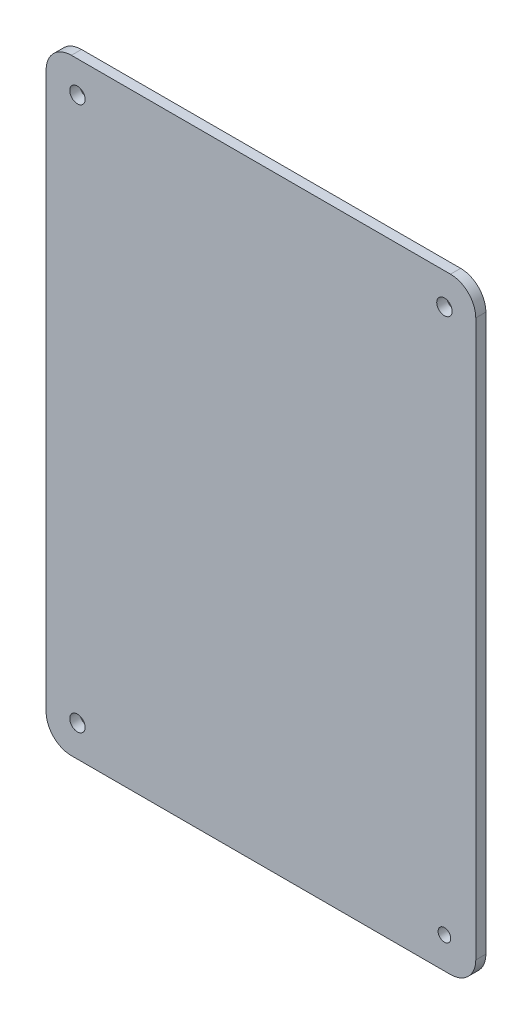
ISO-10303-21;
HEADER;
FILE_DESCRIPTION(('STEP AP214'),'2;1');
FILE_NAME('part.step','',(''),(''),'','','');
FILE_SCHEMA(('AUTOMOTIVE_DESIGN { 1 0 10303 214 1 1 1 1 }'));
ENDSEC;
DATA;
#1=APPLICATION_CONTEXT('core data for automotive mechanical design processes');
#2=APPLICATION_PROTOCOL_DEFINITION('international standard','automotive_design',2000,#1);
#3=PRODUCT_CONTEXT('',#1,'mechanical');
#4=PRODUCT('Part','Part','',(#3));
#5=PRODUCT_RELATED_PRODUCT_CATEGORY('part','',(#4));
#6=PRODUCT_DEFINITION_FORMATION('','',#4);
#7=PRODUCT_DEFINITION_CONTEXT('part definition',#1,'design');
#8=PRODUCT_DEFINITION('design','',#6,#7);
#9=PRODUCT_DEFINITION_SHAPE('','',#8);
#10=(LENGTH_UNIT() NAMED_UNIT(*) SI_UNIT(.MILLI.,.METRE.));
#11=(NAMED_UNIT(*) PLANE_ANGLE_UNIT() SI_UNIT($,.RADIAN.));
#12=(NAMED_UNIT(*) SI_UNIT($,.STERADIAN.) SOLID_ANGLE_UNIT());
#13=UNCERTAINTY_MEASURE_WITH_UNIT(LENGTH_MEASURE(1.E-05),#10,'distance_accuracy_value','');
#14=(GEOMETRIC_REPRESENTATION_CONTEXT(3) GLOBAL_UNCERTAINTY_ASSIGNED_CONTEXT((#13)) GLOBAL_UNIT_ASSIGNED_CONTEXT((#10,
#11,#12)) REPRESENTATION_CONTEXT('',''));
#15=CARTESIAN_POINT('',(0.,0.,0.));
#16=DIRECTION('',(0.,0.,1.));
#17=DIRECTION('',(1.,0.,0.));
#18=AXIS2_PLACEMENT_3D('',#15,#16,#17);
#19=CARTESIAN_POINT('',(37.5,52.2608294930875,2.));
#20=DIRECTION('',(0.,0.,1.));
#21=DIRECTION('',(1.,0.,0.));
#22=AXIS2_PLACEMENT_3D('',#19,#20,#21);
#23=PLANE('',#22);
#24=CARTESIAN_POINT('',(-36.3,51.0608294930875,2.));
#25=DIRECTION('',(0.,0.,1.));
#26=DIRECTION('',(1.,0.,0.));
#27=AXIS2_PLACEMENT_3D('',#24,#25,#26);
#28=CIRCLE('',#27,1.525);
#29=CARTESIAN_POINT('',(-34.775,51.0608294930875,2.));
#30=VERTEX_POINT('',#29);
#31=EDGE_CURVE('E294',#30,#30,#28,.T.);
#32=ORIENTED_EDGE('',*,*,#31,.F.);
#33=EDGE_LOOP('',(#32));
#34=FACE_BOUND('',#33,.T.);
#35=CARTESIAN_POINT('',(36.3,-56.5391705069125,2.));
#36=DIRECTION('',(0.,0.,1.));
#37=DIRECTION('',(1.,0.,0.));
#38=AXIS2_PLACEMENT_3D('',#35,#36,#37);
#39=CIRCLE('',#38,1.25);
#40=CARTESIAN_POINT('',(37.55,-56.5391705069125,2.));
#41=VERTEX_POINT('',#40);
#42=EDGE_CURVE('E150',#41,#41,#39,.T.);
#43=ORIENTED_EDGE('',*,*,#42,.F.);
#44=EDGE_LOOP('',(#43));
#45=FACE_BOUND('',#44,.T.);
#46=CARTESIAN_POINT('',(37.5,52.2608294930875,2.));
#47=DIRECTION('',(0.,0.,1.));
#48=DIRECTION('',(1.,0.,0.));
#49=AXIS2_PLACEMENT_3D('',#46,#47,#48);
#50=CIRCLE('',#49,4.99999999999999);
#51=CARTESIAN_POINT('',(42.5,52.2608294930875,2.));
#52=VERTEX_POINT('',#51);
#53=CARTESIAN_POINT('',(37.5,57.2608294930875,2.));
#54=VERTEX_POINT('',#53);
#55=EDGE_CURVE('E158',#52,#54,#50,.T.);
#56=ORIENTED_EDGE('',*,*,#55,.T.);
#57=DIRECTION('',(-1.,0.,0.));
#58=VECTOR('',#57,1.);
#59=CARTESIAN_POINT('',(-37.5,57.2608294930875,2.));
#60=LINE('',#59,#58);
#61=CARTESIAN_POINT('',(-37.5,57.2608294930875,2.));
#62=VERTEX_POINT('',#61);
#63=EDGE_CURVE('E102',#54,#62,#60,.T.);
#64=ORIENTED_EDGE('',*,*,#63,.T.);
#65=CARTESIAN_POINT('',(-37.5,52.2608294930875,2.));
#66=DIRECTION('',(0.,0.,1.));
#67=DIRECTION('',(1.,0.,0.));
#68=AXIS2_PLACEMENT_3D('',#65,#66,#67);
#69=CIRCLE('',#68,5.);
#70=CARTESIAN_POINT('',(-42.5,52.2608294930875,2.));
#71=VERTEX_POINT('',#70);
#72=EDGE_CURVE('E312',#62,#71,#69,.T.);
#73=ORIENTED_EDGE('',*,*,#72,.T.);
#74=DIRECTION('',(0.,-1.,0.));
#75=VECTOR('',#74,1.);
#76=CARTESIAN_POINT('',(-42.5,-57.7391705069125,2.));
#77=LINE('',#76,#75);
#78=CARTESIAN_POINT('',(-42.5,-57.7391705069125,2.));
#79=VERTEX_POINT('',#78);
#80=EDGE_CURVE('E314',#71,#79,#77,.T.);
#81=ORIENTED_EDGE('',*,*,#80,.T.);
#82=CARTESIAN_POINT('',(-37.5,-57.7391705069125,2.));
#83=DIRECTION('',(0.,0.,1.));
#84=DIRECTION('',(1.,0.,0.));
#85=AXIS2_PLACEMENT_3D('',#82,#83,#84);
#86=CIRCLE('',#85,5.);
#87=CARTESIAN_POINT('',(-37.5,-62.7391705069125,2.));
#88=VERTEX_POINT('',#87);
#89=EDGE_CURVE('E129',#79,#88,#86,.T.);
#90=ORIENTED_EDGE('',*,*,#89,.T.);
#91=DIRECTION('',(1.,0.,0.));
#92=VECTOR('',#91,1.);
#93=CARTESIAN_POINT('',(-37.5,-62.7391705069125,2.));
#94=LINE('',#93,#92);
#95=CARTESIAN_POINT('',(37.5,-62.7391705069125,2.));
#96=VERTEX_POINT('',#95);
#97=EDGE_CURVE('E119',#88,#96,#94,.T.);
#98=ORIENTED_EDGE('',*,*,#97,.T.);
#99=CARTESIAN_POINT('',(37.5,-57.7391705069125,2.));
#100=DIRECTION('',(0.,0.,1.));
#101=DIRECTION('',(1.,0.,0.));
#102=AXIS2_PLACEMENT_3D('',#99,#100,#101);
#103=CIRCLE('',#102,5.);
#104=CARTESIAN_POINT('',(42.5,-57.7391705069125,2.));
#105=VERTEX_POINT('',#104);
#106=EDGE_CURVE('E121',#96,#105,#103,.T.);
#107=ORIENTED_EDGE('',*,*,#106,.T.);
#108=DIRECTION('',(0.,1.,0.));
#109=VECTOR('',#108,1.);
#110=CARTESIAN_POINT('',(42.5,-57.7391705069125,2.));
#111=LINE('',#110,#109);
#112=EDGE_CURVE('E58',#105,#52,#111,.T.);
#113=ORIENTED_EDGE('',*,*,#112,.T.);
#114=EDGE_LOOP('',(#56,#64,#73,#81,#90,#98,#107,#113));
#115=FACE_BOUND('',#114,.T.);
#116=CARTESIAN_POINT('',(36.3,51.0608294930875,2.));
#117=DIRECTION('',(0.,0.,1.));
#118=DIRECTION('',(1.,0.,0.));
#119=AXIS2_PLACEMENT_3D('',#116,#117,#118);
#120=CIRCLE('',#119,1.525);
#121=CARTESIAN_POINT('',(37.825,51.0608294930875,2.));
#122=VERTEX_POINT('',#121);
#123=EDGE_CURVE('E301',#122,#122,#120,.T.);
#124=ORIENTED_EDGE('',*,*,#123,.F.);
#125=EDGE_LOOP('',(#124));
#126=FACE_BOUND('',#125,.T.);
#127=CARTESIAN_POINT('',(-36.3,-56.5391705069125,2.));
#128=DIRECTION('',(0.,0.,1.));
#129=DIRECTION('',(1.,0.,0.));
#130=AXIS2_PLACEMENT_3D('',#127,#128,#129);
#131=CIRCLE('',#130,1.525);
#132=CARTESIAN_POINT('',(-34.775,-56.5391705069125,2.));
#133=VERTEX_POINT('',#132);
#134=EDGE_CURVE('E288',#133,#133,#131,.T.);
#135=ORIENTED_EDGE('',*,*,#134,.F.);
#136=EDGE_LOOP('',(#135));
#137=FACE_BOUND('',#136,.T.);
#138=ADVANCED_FACE('F43',(#34,#45,#115,#126,#137),#23,.T.);
#139=CARTESIAN_POINT('',(37.5,52.2608294930875,0.));
#140=DIRECTION('',(0.,0.,1.));
#141=DIRECTION('',(1.,0.,0.));
#142=AXIS2_PLACEMENT_3D('',#139,#140,#141);
#143=PLANE('',#142);
#144=CARTESIAN_POINT('',(-19.5,-2.73917050691248,0.));
#145=DIRECTION('',(0.,0.,1.));
#146=DIRECTION('',(1.,0.,0.));
#147=AXIS2_PLACEMENT_3D('',#144,#145,#146);
#148=CIRCLE('',#147,4.);
#149=CARTESIAN_POINT('',(-15.5,-2.73917050691248,0.));
#150=VERTEX_POINT('',#149);
#151=EDGE_CURVE('E187',#150,#150,#148,.T.);
#152=ORIENTED_EDGE('',*,*,#151,.T.);
#153=EDGE_LOOP('',(#152));
#154=FACE_BOUND('',#153,.T.);
#155=CARTESIAN_POINT('',(-19.5,36.2608294930875,0.));
#156=DIRECTION('',(0.,0.,1.));
#157=DIRECTION('',(1.,0.,0.));
#158=AXIS2_PLACEMENT_3D('',#155,#156,#157);
#159=CIRCLE('',#158,4.00000000000001);
#160=CARTESIAN_POINT('',(-15.5,36.2608294930875,0.));
#161=VERTEX_POINT('',#160);
#162=EDGE_CURVE('E182',#161,#161,#159,.T.);
#163=ORIENTED_EDGE('',*,*,#162,.T.);
#164=EDGE_LOOP('',(#163));
#165=FACE_BOUND('',#164,.T.);
#166=CARTESIAN_POINT('',(19.5,-2.73917050691248,0.));
#167=DIRECTION('',(0.,0.,1.));
#168=DIRECTION('',(1.,0.,0.));
#169=AXIS2_PLACEMENT_3D('',#166,#167,#168);
#170=CIRCLE('',#169,4.);
#171=CARTESIAN_POINT('',(23.5,-2.73917050691248,0.));
#172=VERTEX_POINT('',#171);
#173=EDGE_CURVE('E179',#172,#172,#170,.T.);
#174=ORIENTED_EDGE('',*,*,#173,.T.);
#175=EDGE_LOOP('',(#174));
#176=FACE_BOUND('',#175,.T.);
#177=CARTESIAN_POINT('',(19.5,36.2608294930875,0.));
#178=DIRECTION('',(0.,0.,1.));
#179=DIRECTION('',(1.,0.,0.));
#180=AXIS2_PLACEMENT_3D('',#177,#178,#179);
#181=CIRCLE('',#180,4.);
#182=CARTESIAN_POINT('',(23.5,36.2608294930875,0.));
#183=VERTEX_POINT('',#182);
#184=EDGE_CURVE('E180',#183,#183,#181,.T.);
#185=ORIENTED_EDGE('',*,*,#184,.T.);
#186=EDGE_LOOP('',(#185));
#187=FACE_BOUND('',#186,.T.);
#188=CARTESIAN_POINT('',(37.5,52.2608294930875,0.));
#189=DIRECTION('',(0.,0.,1.));
#190=DIRECTION('',(1.,0.,0.));
#191=AXIS2_PLACEMENT_3D('',#188,#189,#190);
#192=CIRCLE('',#191,4.99999999999999);
#193=CARTESIAN_POINT('',(42.5,52.2608294930875,0.));
#194=VERTEX_POINT('',#193);
#195=CARTESIAN_POINT('',(37.5,57.2608294930875,0.));
#196=VERTEX_POINT('',#195);
#197=EDGE_CURVE('E144',#194,#196,#192,.T.);
#198=ORIENTED_EDGE('',*,*,#197,.F.);
#199=DIRECTION('',(0.,1.,0.));
#200=VECTOR('',#199,1.);
#201=CARTESIAN_POINT('',(42.5,-57.7391705069125,0.));
#202=LINE('',#201,#200);
#203=CARTESIAN_POINT('',(42.5,-57.7391705069125,0.));
#204=VERTEX_POINT('',#203);
#205=EDGE_CURVE('E98',#204,#194,#202,.T.);
#206=ORIENTED_EDGE('',*,*,#205,.F.);
#207=CARTESIAN_POINT('',(37.5,-57.7391705069125,0.));
#208=DIRECTION('',(0.,0.,1.));
#209=DIRECTION('',(1.,0.,0.));
#210=AXIS2_PLACEMENT_3D('',#207,#208,#209);
#211=CIRCLE('',#210,5.);
#212=CARTESIAN_POINT('',(37.5,-62.7391705069125,0.));
#213=VERTEX_POINT('',#212);
#214=EDGE_CURVE('E86',#213,#204,#211,.T.);
#215=ORIENTED_EDGE('',*,*,#214,.F.);
#216=DIRECTION('',(1.,0.,0.));
#217=VECTOR('',#216,1.);
#218=CARTESIAN_POINT('',(-37.5,-62.7391705069125,0.));
#219=LINE('',#218,#217);
#220=CARTESIAN_POINT('',(-37.5,-62.7391705069125,0.));
#221=VERTEX_POINT('',#220);
#222=EDGE_CURVE('E134',#221,#213,#219,.T.);
#223=ORIENTED_EDGE('',*,*,#222,.F.);
#224=CARTESIAN_POINT('',(-37.5,-57.7391705069125,0.));
#225=DIRECTION('',(0.,0.,1.));
#226=DIRECTION('',(1.,0.,0.));
#227=AXIS2_PLACEMENT_3D('',#224,#225,#226);
#228=CIRCLE('',#227,5.);
#229=CARTESIAN_POINT('',(-42.5,-57.7391705069125,0.));
#230=VERTEX_POINT('',#229);
#231=EDGE_CURVE('E154',#230,#221,#228,.T.);
#232=ORIENTED_EDGE('',*,*,#231,.F.);
#233=DIRECTION('',(0.,-1.,0.));
#234=VECTOR('',#233,1.);
#235=CARTESIAN_POINT('',(-42.5,-57.7391705069125,0.));
#236=LINE('',#235,#234);
#237=CARTESIAN_POINT('',(-42.5,52.2608294930875,0.));
#238=VERTEX_POINT('',#237);
#239=EDGE_CURVE('E155',#238,#230,#236,.T.);
#240=ORIENTED_EDGE('',*,*,#239,.F.);
#241=CARTESIAN_POINT('',(-37.5,52.2608294930875,0.));
#242=DIRECTION('',(0.,0.,1.));
#243=DIRECTION('',(1.,0.,0.));
#244=AXIS2_PLACEMENT_3D('',#241,#242,#243);
#245=CIRCLE('',#244,5.);
#246=CARTESIAN_POINT('',(-37.5,57.2608294930875,0.));
#247=VERTEX_POINT('',#246);
#248=EDGE_CURVE('E147',#247,#238,#245,.T.);
#249=ORIENTED_EDGE('',*,*,#248,.F.);
#250=DIRECTION('',(-1.,0.,0.));
#251=VECTOR('',#250,1.);
#252=CARTESIAN_POINT('',(-37.5,57.2608294930875,0.));
#253=LINE('',#252,#251);
#254=EDGE_CURVE('E146',#196,#247,#253,.T.);
#255=ORIENTED_EDGE('',*,*,#254,.F.);
#256=EDGE_LOOP('',(#198,#206,#215,#223,#232,#240,#249,#255));
#257=FACE_BOUND('',#256,.T.);
#258=CARTESIAN_POINT('',(36.3,-56.5391705069125,0.));
#259=DIRECTION('',(0.,0.,1.));
#260=DIRECTION('',(1.,0.,0.));
#261=AXIS2_PLACEMENT_3D('',#258,#259,#260);
#262=CIRCLE('',#261,1.25);
#263=CARTESIAN_POINT('',(37.55,-56.5391705069125,0.));
#264=VERTEX_POINT('',#263);
#265=EDGE_CURVE('E302',#264,#264,#262,.T.);
#266=ORIENTED_EDGE('',*,*,#265,.T.);
#267=EDGE_LOOP('',(#266));
#268=FACE_BOUND('',#267,.T.);
#269=CARTESIAN_POINT('',(36.3,51.0608294930875,0.));
#270=DIRECTION('',(0.,0.,1.));
#271=DIRECTION('',(1.,0.,0.));
#272=AXIS2_PLACEMENT_3D('',#269,#270,#271);
#273=CIRCLE('',#272,1.525);
#274=CARTESIAN_POINT('',(37.825,51.0608294930875,0.));
#275=VERTEX_POINT('',#274);
#276=EDGE_CURVE('E296',#275,#275,#273,.T.);
#277=ORIENTED_EDGE('',*,*,#276,.T.);
#278=EDGE_LOOP('',(#277));
#279=FACE_BOUND('',#278,.T.);
#280=CARTESIAN_POINT('',(-36.3,51.0608294930875,0.));
#281=DIRECTION('',(0.,0.,1.));
#282=DIRECTION('',(1.,0.,0.));
#283=AXIS2_PLACEMENT_3D('',#280,#281,#282);
#284=CIRCLE('',#283,1.525);
#285=CARTESIAN_POINT('',(-34.775,51.0608294930875,0.));
#286=VERTEX_POINT('',#285);
#287=EDGE_CURVE('E292',#286,#286,#284,.T.);
#288=ORIENTED_EDGE('',*,*,#287,.T.);
#289=EDGE_LOOP('',(#288));
#290=FACE_BOUND('',#289,.T.);
#291=CARTESIAN_POINT('',(-36.3,-56.5391705069125,0.));
#292=DIRECTION('',(0.,0.,1.));
#293=DIRECTION('',(1.,0.,0.));
#294=AXIS2_PLACEMENT_3D('',#291,#292,#293);
#295=CIRCLE('',#294,1.525);
#296=CARTESIAN_POINT('',(-34.775,-56.5391705069125,0.));
#297=VERTEX_POINT('',#296);
#298=EDGE_CURVE('E290',#297,#297,#295,.T.);
#299=ORIENTED_EDGE('',*,*,#298,.T.);
#300=EDGE_LOOP('',(#299));
#301=FACE_BOUND('',#300,.T.);
#302=ADVANCED_FACE('F214',(#154,#165,#176,#187,#257,#268,#279,#290,#301),#143,.F.);
#303=CARTESIAN_POINT('',(37.5,52.2608294930875,2.));
#304=DIRECTION('',(0.,0.,-1.));
#305=DIRECTION('',(-1.,0.,0.));
#306=AXIS2_PLACEMENT_3D('',#303,#304,#305);
#307=CYLINDRICAL_SURFACE('',#306,4.99999999999999);
#308=ORIENTED_EDGE('',*,*,#197,.T.);
#309=DIRECTION('',(0.,0.,-1.));
#310=VECTOR('',#309,1.);
#311=CARTESIAN_POINT('',(37.5,57.2608294930875,2.));
#312=LINE('',#311,#310);
#313=EDGE_CURVE('E175',#54,#196,#312,.T.);
#314=ORIENTED_EDGE('',*,*,#313,.F.);
#315=ORIENTED_EDGE('',*,*,#55,.F.);
#316=DIRECTION('',(0.,0.,-1.));
#317=VECTOR('',#316,1.);
#318=CARTESIAN_POINT('',(42.5,52.2608294930875,2.));
#319=LINE('',#318,#317);
#320=EDGE_CURVE('E137',#52,#194,#319,.T.);
#321=ORIENTED_EDGE('',*,*,#320,.T.);
#322=EDGE_LOOP('',(#308,#314,#315,#321));
#323=FACE_BOUND('',#322,.T.);
#324=ADVANCED_FACE('F218',(#323),#307,.T.);
#325=CARTESIAN_POINT('',(-37.5,57.2608294930875,2.));
#326=DIRECTION('',(0.,-1.,0.));
#327=DIRECTION('',(0.,0.,-1.));
#328=AXIS2_PLACEMENT_3D('',#325,#326,#327);
#329=PLANE('',#328);
#330=ORIENTED_EDGE('',*,*,#254,.T.);
#331=DIRECTION('',(0.,0.,-1.));
#332=VECTOR('',#331,1.);
#333=CARTESIAN_POINT('',(-37.5,57.2608294930875,2.));
#334=LINE('',#333,#332);
#335=EDGE_CURVE('E169',#62,#247,#334,.T.);
#336=ORIENTED_EDGE('',*,*,#335,.F.);
#337=ORIENTED_EDGE('',*,*,#63,.F.);
#338=ORIENTED_EDGE('',*,*,#313,.T.);
#339=EDGE_LOOP('',(#330,#336,#337,#338));
#340=FACE_BOUND('',#339,.T.);
#341=ADVANCED_FACE('F244',(#340),#329,.F.);
#342=CARTESIAN_POINT('',(-37.5,52.2608294930875,2.));
#343=DIRECTION('',(0.,0.,-1.));
#344=DIRECTION('',(-1.,0.,0.));
#345=AXIS2_PLACEMENT_3D('',#342,#343,#344);
#346=CYLINDRICAL_SURFACE('',#345,5.);
#347=ORIENTED_EDGE('',*,*,#248,.T.);
#348=DIRECTION('',(0.,0.,-1.));
#349=VECTOR('',#348,1.);
#350=CARTESIAN_POINT('',(-42.5,52.2608294930875,2.));
#351=LINE('',#350,#349);
#352=EDGE_CURVE('E168',#71,#238,#351,.T.);
#353=ORIENTED_EDGE('',*,*,#352,.F.);
#354=ORIENTED_EDGE('',*,*,#72,.F.);
#355=ORIENTED_EDGE('',*,*,#335,.T.);
#356=EDGE_LOOP('',(#347,#353,#354,#355));
#357=FACE_BOUND('',#356,.T.);
#358=ADVANCED_FACE('F241',(#357),#346,.T.);
#359=CARTESIAN_POINT('',(-42.5,-57.7391705069125,2.));
#360=DIRECTION('',(1.,0.,0.));
#361=DIRECTION('',(0.,0.,-1.));
#362=AXIS2_PLACEMENT_3D('',#359,#360,#361);
#363=PLANE('',#362);
#364=ORIENTED_EDGE('',*,*,#239,.T.);
#365=DIRECTION('',(0.,0.,-1.));
#366=VECTOR('',#365,1.);
#367=CARTESIAN_POINT('',(-42.5,-57.7391705069125,2.));
#368=LINE('',#367,#366);
#369=EDGE_CURVE('E161',#79,#230,#368,.T.);
#370=ORIENTED_EDGE('',*,*,#369,.F.);
#371=ORIENTED_EDGE('',*,*,#80,.F.);
#372=ORIENTED_EDGE('',*,*,#352,.T.);
#373=EDGE_LOOP('',(#364,#370,#371,#372));
#374=FACE_BOUND('',#373,.T.);
#375=ADVANCED_FACE('F240',(#374),#363,.F.);
#376=CARTESIAN_POINT('',(-37.5,-57.7391705069125,2.));
#377=DIRECTION('',(0.,0.,-1.));
#378=DIRECTION('',(-1.,0.,0.));
#379=AXIS2_PLACEMENT_3D('',#376,#377,#378);
#380=CYLINDRICAL_SURFACE('',#379,5.);
#381=ORIENTED_EDGE('',*,*,#231,.T.);
#382=DIRECTION('',(0.,0.,-1.));
#383=VECTOR('',#382,1.);
#384=CARTESIAN_POINT('',(-37.5,-62.7391705069125,2.));
#385=LINE('',#384,#383);
#386=EDGE_CURVE('E131',#88,#221,#385,.T.);
#387=ORIENTED_EDGE('',*,*,#386,.F.);
#388=ORIENTED_EDGE('',*,*,#89,.F.);
#389=ORIENTED_EDGE('',*,*,#369,.T.);
#390=EDGE_LOOP('',(#381,#387,#388,#389));
#391=FACE_BOUND('',#390,.T.);
#392=ADVANCED_FACE('F234',(#391),#380,.T.);
#393=CARTESIAN_POINT('',(-37.5,-62.7391705069125,2.));
#394=DIRECTION('',(0.,1.,0.));
#395=DIRECTION('',(0.,0.,1.));
#396=AXIS2_PLACEMENT_3D('',#393,#394,#395);
#397=PLANE('',#396);
#398=ORIENTED_EDGE('',*,*,#222,.T.);
#399=DIRECTION('',(0.,0.,-1.));
#400=VECTOR('',#399,1.);
#401=CARTESIAN_POINT('',(37.5,-62.7391705069125,2.));
#402=LINE('',#401,#400);
#403=EDGE_CURVE('E132',#96,#213,#402,.T.);
#404=ORIENTED_EDGE('',*,*,#403,.F.);
#405=ORIENTED_EDGE('',*,*,#97,.F.);
#406=ORIENTED_EDGE('',*,*,#386,.T.);
#407=EDGE_LOOP('',(#398,#404,#405,#406));
#408=FACE_BOUND('',#407,.T.);
#409=ADVANCED_FACE('F135',(#408),#397,.F.);
#410=CARTESIAN_POINT('',(37.5,-57.7391705069125,2.));
#411=DIRECTION('',(0.,0.,-1.));
#412=DIRECTION('',(-1.,0.,0.));
#413=AXIS2_PLACEMENT_3D('',#410,#411,#412);
#414=CYLINDRICAL_SURFACE('',#413,5.);
#415=ORIENTED_EDGE('',*,*,#214,.T.);
#416=DIRECTION('',(0.,0.,-1.));
#417=VECTOR('',#416,1.);
#418=CARTESIAN_POINT('',(42.5,-57.7391705069125,2.));
#419=LINE('',#418,#417);
#420=EDGE_CURVE('E139',#105,#204,#419,.T.);
#421=ORIENTED_EDGE('',*,*,#420,.F.);
#422=ORIENTED_EDGE('',*,*,#106,.F.);
#423=ORIENTED_EDGE('',*,*,#403,.T.);
#424=EDGE_LOOP('',(#415,#421,#422,#423));
#425=FACE_BOUND('',#424,.T.);
#426=ADVANCED_FACE('F140',(#425),#414,.T.);
#427=CARTESIAN_POINT('',(42.5,-57.7391705069125,2.));
#428=DIRECTION('',(-1.,0.,0.));
#429=DIRECTION('',(0.,0.,1.));
#430=AXIS2_PLACEMENT_3D('',#427,#428,#429);
#431=PLANE('',#430);
#432=ORIENTED_EDGE('',*,*,#205,.T.);
#433=ORIENTED_EDGE('',*,*,#320,.F.);
#434=ORIENTED_EDGE('',*,*,#112,.F.);
#435=ORIENTED_EDGE('',*,*,#420,.T.);
#436=EDGE_LOOP('',(#432,#433,#434,#435));
#437=FACE_BOUND('',#436,.T.);
#438=ADVANCED_FACE('F227',(#437),#431,.F.);
#439=CARTESIAN_POINT('',(36.3,-56.5391705069125,2.));
#440=DIRECTION('',(0.,0.,-1.));
#441=DIRECTION('',(-1.,0.,0.));
#442=AXIS2_PLACEMENT_3D('',#439,#440,#441);
#443=CYLINDRICAL_SURFACE('',#442,1.25);
#444=ORIENTED_EDGE('',*,*,#42,.T.);
#445=EDGE_LOOP('',(#444));
#446=FACE_BOUND('',#445,.T.);
#447=ORIENTED_EDGE('',*,*,#265,.F.);
#448=EDGE_LOOP('',(#447));
#449=FACE_BOUND('',#448,.T.);
#450=ADVANCED_FACE('F223',(#446,#449),#443,.F.);
#451=CARTESIAN_POINT('',(36.3,51.0608294930875,2.));
#452=DIRECTION('',(0.,0.,-1.));
#453=DIRECTION('',(-1.,0.,0.));
#454=AXIS2_PLACEMENT_3D('',#451,#452,#453);
#455=CYLINDRICAL_SURFACE('',#454,1.525);
#456=ORIENTED_EDGE('',*,*,#123,.T.);
#457=EDGE_LOOP('',(#456));
#458=FACE_BOUND('',#457,.T.);
#459=ORIENTED_EDGE('',*,*,#276,.F.);
#460=EDGE_LOOP('',(#459));
#461=FACE_BOUND('',#460,.T.);
#462=ADVANCED_FACE('F346',(#458,#461),#455,.F.);
#463=CARTESIAN_POINT('',(-36.3,51.0608294930875,2.));
#464=DIRECTION('',(0.,0.,-1.));
#465=DIRECTION('',(-1.,0.,0.));
#466=AXIS2_PLACEMENT_3D('',#463,#464,#465);
#467=CYLINDRICAL_SURFACE('',#466,1.525);
#468=ORIENTED_EDGE('',*,*,#31,.T.);
#469=EDGE_LOOP('',(#468));
#470=FACE_BOUND('',#469,.T.);
#471=ORIENTED_EDGE('',*,*,#287,.F.);
#472=EDGE_LOOP('',(#471));
#473=FACE_BOUND('',#472,.T.);
#474=ADVANCED_FACE('F339',(#470,#473),#467,.F.);
#475=CARTESIAN_POINT('',(-36.3,-56.5391705069125,2.));
#476=DIRECTION('',(0.,0.,-1.));
#477=DIRECTION('',(-1.,0.,0.));
#478=AXIS2_PLACEMENT_3D('',#475,#476,#477);
#479=CYLINDRICAL_SURFACE('',#478,1.525);
#480=ORIENTED_EDGE('',*,*,#134,.T.);
#481=EDGE_LOOP('',(#480));
#482=FACE_BOUND('',#481,.T.);
#483=ORIENTED_EDGE('',*,*,#298,.F.);
#484=EDGE_LOOP('',(#483));
#485=FACE_BOUND('',#484,.T.);
#486=ADVANCED_FACE('F337',(#482,#485),#479,.F.);
#487=CARTESIAN_POINT('',(19.5,36.2608294930875,-8.));
#488=DIRECTION('',(0.,0.,1.));
#489=DIRECTION('',(1.,0.,0.));
#490=AXIS2_PLACEMENT_3D('',#487,#488,#489);
#491=CYLINDRICAL_SURFACE('',#490,2.);
#492=CARTESIAN_POINT('',(19.5,36.2608294930875,-2.));
#493=DIRECTION('',(0.,0.,1.));
#494=DIRECTION('',(1.,0.,0.));
#495=AXIS2_PLACEMENT_3D('',#492,#493,#494);
#496=CIRCLE('',#495,2.);
#497=CARTESIAN_POINT('',(21.5,36.2608294930875,-2.));
#498=VERTEX_POINT('',#497);
#499=EDGE_CURVE('E11',#498,#498,#496,.F.);
#500=ORIENTED_EDGE('',*,*,#499,.T.);
#501=EDGE_LOOP('',(#500));
#502=FACE_BOUND('',#501,.T.);
#503=CARTESIAN_POINT('',(19.5,36.2608294930875,-8.));
#504=DIRECTION('',(0.,0.,-1.));
#505=DIRECTION('',(-1.,0.,0.));
#506=AXIS2_PLACEMENT_3D('',#503,#504,#505);
#507=CIRCLE('',#506,2.);
#508=CARTESIAN_POINT('',(17.5,36.2608294930875,-8.));
#509=VERTEX_POINT('',#508);
#510=EDGE_CURVE('E278',#509,#509,#507,.T.);
#511=ORIENTED_EDGE('',*,*,#510,.F.);
#512=EDGE_LOOP('',(#511));
#513=FACE_BOUND('',#512,.T.);
#514=ADVANCED_FACE('F336',(#502,#513),#491,.T.);
#515=CARTESIAN_POINT('',(19.5,36.2608294930875,-8.));
#516=DIRECTION('',(0.,0.,-1.));
#517=DIRECTION('',(-1.,0.,0.));
#518=AXIS2_PLACEMENT_3D('',#515,#516,#517);
#519=PLANE('',#518);
#520=CARTESIAN_POINT('',(19.5,36.2608294930875,-8.));
#521=DIRECTION('',(0.,0.,-1.));
#522=DIRECTION('',(-1.,0.,0.));
#523=AXIS2_PLACEMENT_3D('',#520,#521,#522);
#524=CIRCLE('',#523,1.525);
#525=CARTESIAN_POINT('',(17.975,36.2608294930875,-8.));
#526=VERTEX_POINT('',#525);
#527=EDGE_CURVE('E655',#526,#526,#524,.T.);
#528=ORIENTED_EDGE('',*,*,#527,.F.);
#529=EDGE_LOOP('',(#528));
#530=FACE_BOUND('',#529,.T.);
#531=ORIENTED_EDGE('',*,*,#510,.T.);
#532=EDGE_LOOP('',(#531));
#533=FACE_BOUND('',#532,.T.);
#534=ADVANCED_FACE('F350',(#530,#533),#519,.T.);
#535=CARTESIAN_POINT('',(-19.5,36.2608294930875,-8.));
#536=DIRECTION('',(0.,0.,1.));
#537=DIRECTION('',(1.,0.,0.));
#538=AXIS2_PLACEMENT_3D('',#535,#536,#537);
#539=CYLINDRICAL_SURFACE('',#538,2.00000000000001);
#540=CARTESIAN_POINT('',(-19.5,36.2608294930875,-2.));
#541=DIRECTION('',(0.,0.,1.));
#542=DIRECTION('',(1.,0.,0.));
#543=AXIS2_PLACEMENT_3D('',#540,#541,#542);
#544=CIRCLE('',#543,2.00000000000001);
#545=CARTESIAN_POINT('',(-17.5,36.2608294930875,-2.));
#546=VERTEX_POINT('',#545);
#547=EDGE_CURVE('E186',#546,#546,#544,.F.);
#548=ORIENTED_EDGE('',*,*,#547,.T.);
#549=EDGE_LOOP('',(#548));
#550=FACE_BOUND('',#549,.T.);
#551=CARTESIAN_POINT('',(-19.5,36.2608294930875,-8.));
#552=DIRECTION('',(0.,0.,-1.));
#553=DIRECTION('',(-1.,0.,0.));
#554=AXIS2_PLACEMENT_3D('',#551,#552,#553);
#555=CIRCLE('',#554,2.00000000000001);
#556=CARTESIAN_POINT('',(-21.5,36.2608294930875,-8.));
#557=VERTEX_POINT('',#556);
#558=EDGE_CURVE('E273',#557,#557,#555,.T.);
#559=ORIENTED_EDGE('',*,*,#558,.F.);
#560=EDGE_LOOP('',(#559));
#561=FACE_BOUND('',#560,.T.);
#562=ADVANCED_FACE('F433',(#550,#561),#539,.T.);
#563=CARTESIAN_POINT('',(-19.5,36.2608294930875,-8.));
#564=DIRECTION('',(0.,0.,-1.));
#565=DIRECTION('',(-1.,0.,0.));
#566=AXIS2_PLACEMENT_3D('',#563,#564,#565);
#567=PLANE('',#566);
#568=CARTESIAN_POINT('',(-19.5,36.2608294930875,-8.));
#569=DIRECTION('',(0.,0.,-1.));
#570=DIRECTION('',(-1.,0.,0.));
#571=AXIS2_PLACEMENT_3D('',#568,#569,#570);
#572=CIRCLE('',#571,1.525);
#573=CARTESIAN_POINT('',(-21.025,36.2608294930875,-8.));
#574=VERTEX_POINT('',#573);
#575=EDGE_CURVE('E668',#574,#574,#572,.T.);
#576=ORIENTED_EDGE('',*,*,#575,.F.);
#577=EDGE_LOOP('',(#576));
#578=FACE_BOUND('',#577,.T.);
#579=ORIENTED_EDGE('',*,*,#558,.T.);
#580=EDGE_LOOP('',(#579));
#581=FACE_BOUND('',#580,.T.);
#582=ADVANCED_FACE('F268',(#578,#581),#567,.T.);
#583=CARTESIAN_POINT('',(-19.5,-2.73917050691248,-8.));
#584=DIRECTION('',(0.,0.,1.));
#585=DIRECTION('',(1.,0.,0.));
#586=AXIS2_PLACEMENT_3D('',#583,#584,#585);
#587=CYLINDRICAL_SURFACE('',#586,2.);
#588=CARTESIAN_POINT('',(-19.5,-2.73917050691248,-2.));
#589=DIRECTION('',(0.,0.,1.));
#590=DIRECTION('',(1.,0.,0.));
#591=AXIS2_PLACEMENT_3D('',#588,#589,#590);
#592=CIRCLE('',#591,2.);
#593=CARTESIAN_POINT('',(-17.5,-2.73917050691248,-2.));
#594=VERTEX_POINT('',#593);
#595=EDGE_CURVE('E172',#594,#594,#592,.F.);
#596=ORIENTED_EDGE('',*,*,#595,.T.);
#597=EDGE_LOOP('',(#596));
#598=FACE_BOUND('',#597,.T.);
#599=CARTESIAN_POINT('',(-19.5,-2.73917050691248,-8.));
#600=DIRECTION('',(0.,0.,-1.));
#601=DIRECTION('',(-1.,0.,0.));
#602=AXIS2_PLACEMENT_3D('',#599,#600,#601);
#603=CIRCLE('',#602,2.);
#604=CARTESIAN_POINT('',(-21.5,-2.73917050691248,-8.));
#605=VERTEX_POINT('',#604);
#606=EDGE_CURVE('E271',#605,#605,#603,.T.);
#607=ORIENTED_EDGE('',*,*,#606,.F.);
#608=EDGE_LOOP('',(#607));
#609=FACE_BOUND('',#608,.T.);
#610=ADVANCED_FACE('F261',(#598,#609),#587,.T.);
#611=CARTESIAN_POINT('',(-19.5,-2.73917050691248,-8.));
#612=DIRECTION('',(0.,0.,-1.));
#613=DIRECTION('',(-1.,0.,0.));
#614=AXIS2_PLACEMENT_3D('',#611,#612,#613);
#615=PLANE('',#614);
#616=CARTESIAN_POINT('',(-19.5,-2.73917050691248,-8.));
#617=DIRECTION('',(0.,0.,-1.));
#618=DIRECTION('',(-1.,0.,0.));
#619=AXIS2_PLACEMENT_3D('',#616,#617,#618);
#620=CIRCLE('',#619,1.525);
#621=CARTESIAN_POINT('',(-21.025,-2.73917050691248,-8.));
#622=VERTEX_POINT('',#621);
#623=EDGE_CURVE('E680',#622,#622,#620,.T.);
#624=ORIENTED_EDGE('',*,*,#623,.F.);
#625=EDGE_LOOP('',(#624));
#626=FACE_BOUND('',#625,.T.);
#627=ORIENTED_EDGE('',*,*,#606,.T.);
#628=EDGE_LOOP('',(#627));
#629=FACE_BOUND('',#628,.T.);
#630=ADVANCED_FACE('F270',(#626,#629),#615,.T.);
#631=CARTESIAN_POINT('',(19.5,-2.73917050691248,-8.));
#632=DIRECTION('',(0.,0.,1.));
#633=DIRECTION('',(1.,0.,0.));
#634=AXIS2_PLACEMENT_3D('',#631,#632,#633);
#635=CYLINDRICAL_SURFACE('',#634,2.);
#636=CARTESIAN_POINT('',(19.5,-2.73917050691248,-2.));
#637=DIRECTION('',(0.,0.,1.));
#638=DIRECTION('',(1.,0.,0.));
#639=AXIS2_PLACEMENT_3D('',#636,#637,#638);
#640=CIRCLE('',#639,2.);
#641=CARTESIAN_POINT('',(21.5,-2.73917050691248,-2.));
#642=VERTEX_POINT('',#641);
#643=EDGE_CURVE('E55',#642,#642,#640,.F.);
#644=ORIENTED_EDGE('',*,*,#643,.T.);
#645=EDGE_LOOP('',(#644));
#646=FACE_BOUND('',#645,.T.);
#647=CARTESIAN_POINT('',(19.5,-2.73917050691248,-8.));
#648=DIRECTION('',(0.,0.,-1.));
#649=DIRECTION('',(-1.,0.,0.));
#650=AXIS2_PLACEMENT_3D('',#647,#648,#649);
#651=CIRCLE('',#650,2.);
#652=CARTESIAN_POINT('',(17.5,-2.73917050691248,-8.));
#653=VERTEX_POINT('',#652);
#654=EDGE_CURVE('E279',#653,#653,#651,.T.);
#655=ORIENTED_EDGE('',*,*,#654,.F.);
#656=EDGE_LOOP('',(#655));
#657=FACE_BOUND('',#656,.T.);
#658=ADVANCED_FACE('F193',(#646,#657),#635,.T.);
#659=CARTESIAN_POINT('',(19.5,-2.73917050691248,-8.));
#660=DIRECTION('',(0.,0.,-1.));
#661=DIRECTION('',(-1.,0.,0.));
#662=AXIS2_PLACEMENT_3D('',#659,#660,#661);
#663=PLANE('',#662);
#664=CARTESIAN_POINT('',(19.5,-2.73917050691248,-8.));
#665=DIRECTION('',(0.,0.,-1.));
#666=DIRECTION('',(-1.,0.,0.));
#667=AXIS2_PLACEMENT_3D('',#664,#665,#666);
#668=CIRCLE('',#667,1.525);
#669=CARTESIAN_POINT('',(17.975,-2.73917050691248,-8.));
#670=VERTEX_POINT('',#669);
#671=EDGE_CURVE('E704',#670,#670,#668,.T.);
#672=ORIENTED_EDGE('',*,*,#671,.F.);
#673=EDGE_LOOP('',(#672));
#674=FACE_BOUND('',#673,.T.);
#675=ORIENTED_EDGE('',*,*,#654,.T.);
#676=EDGE_LOOP('',(#675));
#677=FACE_BOUND('',#676,.T.);
#678=ADVANCED_FACE('F448',(#674,#677),#663,.T.);
#679=CARTESIAN_POINT('',(-19.5,-2.73917050691248,-2.));
#680=DIRECTION('',(0.,0.,-1.));
#681=DIRECTION('',(-1.,0.,0.));
#682=AXIS2_PLACEMENT_3D('',#679,#680,#681);
#683=CONICAL_SURFACE('',#682,1.25,1.02974425867665);
#684=CARTESIAN_POINT('',(-19.5,-2.73917050691248,-1.24892422621555));
#685=VERTEX_POINT('',#684);
#686=VERTEX_LOOP('',#685);
#687=FACE_BOUND('',#686,.T.);
#688=CARTESIAN_POINT('',(-19.5,-2.73917050691248,-2.));
#689=DIRECTION('',(0.,0.,-1.));
#690=DIRECTION('',(-1.,0.,0.));
#691=AXIS2_PLACEMENT_3D('',#688,#689,#690);
#692=CIRCLE('',#691,1.25);
#693=CARTESIAN_POINT('',(-20.75,-2.73917050691248,-2.));
#694=VERTEX_POINT('',#693);
#695=EDGE_CURVE('E285',#694,#694,#692,.T.);
#696=ORIENTED_EDGE('',*,*,#695,.T.);
#697=EDGE_LOOP('',(#696));
#698=FACE_BOUND('',#697,.T.);
#699=ADVANCED_FACE('F470',(#687,#698),#683,.F.);
#700=CARTESIAN_POINT('',(-19.5,-2.73917050691248,-8.));
#701=DIRECTION('',(0.,0.,-1.));
#702=DIRECTION('',(-1.,0.,0.));
#703=AXIS2_PLACEMENT_3D('',#700,#701,#702);
#704=CYLINDRICAL_SURFACE('',#703,1.24999999999999);
#705=ORIENTED_EDGE('',*,*,#695,.F.);
#706=EDGE_LOOP('',(#705));
#707=FACE_BOUND('',#706,.T.);
#708=CARTESIAN_POINT('',(-19.5,-2.73917050691248,-7.725));
#709=DIRECTION('',(0.,0.,-1.));
#710=DIRECTION('',(-1.,0.,0.));
#711=AXIS2_PLACEMENT_3D('',#708,#709,#710);
#712=CIRCLE('',#711,1.24999999999999);
#713=CARTESIAN_POINT('',(-20.75,-2.73917050691248,-7.725));
#714=VERTEX_POINT('',#713);
#715=EDGE_CURVE('E683',#714,#714,#712,.T.);
#716=ORIENTED_EDGE('',*,*,#715,.T.);
#717=EDGE_LOOP('',(#716));
#718=FACE_BOUND('',#717,.T.);
#719=ADVANCED_FACE('F478',(#707,#718),#704,.F.);
#720=CARTESIAN_POINT('',(-19.5,-2.73917050691248,-8.));
#721=DIRECTION('',(0.,0.,-1.));
#722=DIRECTION('',(-1.,0.,0.));
#723=AXIS2_PLACEMENT_3D('',#720,#721,#722);
#724=CONICAL_SURFACE('',#723,1.525,0.78539816339747);
#725=ORIENTED_EDGE('',*,*,#715,.F.);
#726=EDGE_LOOP('',(#725));
#727=FACE_BOUND('',#726,.T.);
#728=ORIENTED_EDGE('',*,*,#623,.T.);
#729=EDGE_LOOP('',(#728));
#730=FACE_BOUND('',#729,.T.);
#731=ADVANCED_FACE('F490',(#727,#730),#724,.F.);
#732=CARTESIAN_POINT('',(-19.5,36.2608294930875,-2.));
#733=DIRECTION('',(0.,0.,-1.));
#734=DIRECTION('',(-1.,0.,0.));
#735=AXIS2_PLACEMENT_3D('',#732,#733,#734);
#736=CONICAL_SURFACE('',#735,1.25,1.02974425867665);
#737=CARTESIAN_POINT('',(-19.5,36.2608294930875,-1.24892422621555));
#738=VERTEX_POINT('',#737);
#739=VERTEX_LOOP('',#738);
#740=FACE_BOUND('',#739,.T.);
#741=CARTESIAN_POINT('',(-19.5,36.2608294930875,-2.));
#742=DIRECTION('',(0.,0.,-1.));
#743=DIRECTION('',(-1.,0.,0.));
#744=AXIS2_PLACEMENT_3D('',#741,#742,#743);
#745=CIRCLE('',#744,1.25);
#746=CARTESIAN_POINT('',(-20.75,36.2608294930875,-2.));
#747=VERTEX_POINT('',#746);
#748=EDGE_CURVE('E671',#747,#747,#745,.T.);
#749=ORIENTED_EDGE('',*,*,#748,.T.);
#750=EDGE_LOOP('',(#749));
#751=FACE_BOUND('',#750,.T.);
#752=ADVANCED_FACE('F501',(#740,#751),#736,.F.);
#753=CARTESIAN_POINT('',(-19.5,36.2608294930875,-8.));
#754=DIRECTION('',(0.,0.,-1.));
#755=DIRECTION('',(-1.,0.,0.));
#756=AXIS2_PLACEMENT_3D('',#753,#754,#755);
#757=CYLINDRICAL_SURFACE('',#756,1.24999999999999);
#758=ORIENTED_EDGE('',*,*,#748,.F.);
#759=EDGE_LOOP('',(#758));
#760=FACE_BOUND('',#759,.T.);
#761=CARTESIAN_POINT('',(-19.5,36.2608294930875,-7.725));
#762=DIRECTION('',(0.,0.,-1.));
#763=DIRECTION('',(-1.,0.,0.));
#764=AXIS2_PLACEMENT_3D('',#761,#762,#763);
#765=CIRCLE('',#764,1.24999999999999);
#766=CARTESIAN_POINT('',(-20.75,36.2608294930875,-7.725));
#767=VERTEX_POINT('',#766);
#768=EDGE_CURVE('E675',#767,#767,#765,.T.);
#769=ORIENTED_EDGE('',*,*,#768,.T.);
#770=EDGE_LOOP('',(#769));
#771=FACE_BOUND('',#770,.T.);
#772=ADVANCED_FACE('F512',(#760,#771),#757,.F.);
#773=CARTESIAN_POINT('',(-19.5,36.2608294930875,-8.));
#774=DIRECTION('',(0.,0.,-1.));
#775=DIRECTION('',(-1.,0.,0.));
#776=AXIS2_PLACEMENT_3D('',#773,#774,#775);
#777=CONICAL_SURFACE('',#776,1.525,0.78539816339747);
#778=ORIENTED_EDGE('',*,*,#768,.F.);
#779=EDGE_LOOP('',(#778));
#780=FACE_BOUND('',#779,.T.);
#781=ORIENTED_EDGE('',*,*,#575,.T.);
#782=EDGE_LOOP('',(#781));
#783=FACE_BOUND('',#782,.T.);
#784=ADVANCED_FACE('F525',(#780,#783),#777,.F.);
#785=CARTESIAN_POINT('',(19.5,36.2608294930875,-2.));
#786=DIRECTION('',(0.,0.,-1.));
#787=DIRECTION('',(-1.,0.,0.));
#788=AXIS2_PLACEMENT_3D('',#785,#786,#787);
#789=CONICAL_SURFACE('',#788,1.25,1.02974425867665);
#790=CARTESIAN_POINT('',(19.5,36.2608294930875,-1.24892422621555));
#791=VERTEX_POINT('',#790);
#792=VERTEX_LOOP('',#791);
#793=FACE_BOUND('',#792,.T.);
#794=CARTESIAN_POINT('',(19.5,36.2608294930875,-2.));
#795=DIRECTION('',(0.,0.,-1.));
#796=DIRECTION('',(-1.,0.,0.));
#797=AXIS2_PLACEMENT_3D('',#794,#795,#796);
#798=CIRCLE('',#797,1.25);
#799=CARTESIAN_POINT('',(18.25,36.2608294930875,-2.));
#800=VERTEX_POINT('',#799);
#801=EDGE_CURVE('E657',#800,#800,#798,.T.);
#802=ORIENTED_EDGE('',*,*,#801,.T.);
#803=EDGE_LOOP('',(#802));
#804=FACE_BOUND('',#803,.T.);
#805=ADVANCED_FACE('F534',(#793,#804),#789,.F.);
#806=CARTESIAN_POINT('',(19.5,36.2608294930875,-8.));
#807=DIRECTION('',(0.,0.,-1.));
#808=DIRECTION('',(-1.,0.,0.));
#809=AXIS2_PLACEMENT_3D('',#806,#807,#808);
#810=CYLINDRICAL_SURFACE('',#809,1.24999999999999);
#811=ORIENTED_EDGE('',*,*,#801,.F.);
#812=EDGE_LOOP('',(#811));
#813=FACE_BOUND('',#812,.T.);
#814=CARTESIAN_POINT('',(19.5,36.2608294930875,-7.725));
#815=DIRECTION('',(0.,0.,-1.));
#816=DIRECTION('',(-1.,0.,0.));
#817=AXIS2_PLACEMENT_3D('',#814,#815,#816);
#818=CIRCLE('',#817,1.24999999999999);
#819=CARTESIAN_POINT('',(18.25,36.2608294930875,-7.725));
#820=VERTEX_POINT('',#819);
#821=EDGE_CURVE('E659',#820,#820,#818,.T.);
#822=ORIENTED_EDGE('',*,*,#821,.T.);
#823=EDGE_LOOP('',(#822));
#824=FACE_BOUND('',#823,.T.);
#825=ADVANCED_FACE('F544',(#813,#824),#810,.F.);
#826=CARTESIAN_POINT('',(19.5,36.2608294930875,-8.));
#827=DIRECTION('',(0.,0.,-1.));
#828=DIRECTION('',(-1.,0.,0.));
#829=AXIS2_PLACEMENT_3D('',#826,#827,#828);
#830=CONICAL_SURFACE('',#829,1.525,0.78539816339747);
#831=ORIENTED_EDGE('',*,*,#821,.F.);
#832=EDGE_LOOP('',(#831));
#833=FACE_BOUND('',#832,.T.);
#834=ORIENTED_EDGE('',*,*,#527,.T.);
#835=EDGE_LOOP('',(#834));
#836=FACE_BOUND('',#835,.T.);
#837=ADVANCED_FACE('F554',(#833,#836),#830,.F.);
#838=CARTESIAN_POINT('',(19.5,-2.73917050691248,-2.));
#839=DIRECTION('',(0.,0.,-1.));
#840=DIRECTION('',(-1.,0.,0.));
#841=AXIS2_PLACEMENT_3D('',#838,#839,#840);
#842=CONICAL_SURFACE('',#841,1.25,1.02974425867665);
#843=CARTESIAN_POINT('',(19.5,-2.73917050691248,-1.24892422621555));
#844=VERTEX_POINT('',#843);
#845=VERTEX_LOOP('',#844);
#846=FACE_BOUND('',#845,.T.);
#847=CARTESIAN_POINT('',(19.5,-2.73917050691248,-2.));
#848=DIRECTION('',(0.,0.,-1.));
#849=DIRECTION('',(-1.,0.,0.));
#850=AXIS2_PLACEMENT_3D('',#847,#848,#849);
#851=CIRCLE('',#850,1.25);
#852=CARTESIAN_POINT('',(18.25,-2.73917050691248,-2.));
#853=VERTEX_POINT('',#852);
#854=EDGE_CURVE('E656',#853,#853,#851,.T.);
#855=ORIENTED_EDGE('',*,*,#854,.T.);
#856=EDGE_LOOP('',(#855));
#857=FACE_BOUND('',#856,.T.);
#858=ADVANCED_FACE('F570',(#846,#857),#842,.F.);
#859=CARTESIAN_POINT('',(19.5,-2.73917050691248,-8.));
#860=DIRECTION('',(0.,0.,-1.));
#861=DIRECTION('',(-1.,0.,0.));
#862=AXIS2_PLACEMENT_3D('',#859,#860,#861);
#863=CYLINDRICAL_SURFACE('',#862,1.24999999999999);
#864=ORIENTED_EDGE('',*,*,#854,.F.);
#865=EDGE_LOOP('',(#864));
#866=FACE_BOUND('',#865,.T.);
#867=CARTESIAN_POINT('',(19.5,-2.73917050691248,-7.725));
#868=DIRECTION('',(0.,0.,-1.));
#869=DIRECTION('',(-1.,0.,0.));
#870=AXIS2_PLACEMENT_3D('',#867,#868,#869);
#871=CIRCLE('',#870,1.24999999999999);
#872=CARTESIAN_POINT('',(18.25,-2.73917050691248,-7.725));
#873=VERTEX_POINT('',#872);
#874=EDGE_CURVE('E661',#873,#873,#871,.T.);
#875=ORIENTED_EDGE('',*,*,#874,.T.);
#876=EDGE_LOOP('',(#875));
#877=FACE_BOUND('',#876,.T.);
#878=ADVANCED_FACE('F260',(#866,#877),#863,.F.);
#879=CARTESIAN_POINT('',(19.5,-2.73917050691248,-8.));
#880=DIRECTION('',(0.,0.,-1.));
#881=DIRECTION('',(-1.,0.,0.));
#882=AXIS2_PLACEMENT_3D('',#879,#880,#881);
#883=CONICAL_SURFACE('',#882,1.525,0.78539816339747);
#884=ORIENTED_EDGE('',*,*,#874,.F.);
#885=EDGE_LOOP('',(#884));
#886=FACE_BOUND('',#885,.T.);
#887=ORIENTED_EDGE('',*,*,#671,.T.);
#888=EDGE_LOOP('',(#887));
#889=FACE_BOUND('',#888,.T.);
#890=ADVANCED_FACE('F255',(#886,#889),#883,.F.);
#891=CARTESIAN_POINT('',(-19.5,-2.73917050691248,-2.));
#892=DIRECTION('',(0.,0.,1.));
#893=DIRECTION('',(1.,0.,0.));
#894=AXIS2_PLACEMENT_3D('',#891,#892,#893);
#895=TOROIDAL_SURFACE('',#894,4.,2.);
#896=ORIENTED_EDGE('',*,*,#151,.F.);
#897=EDGE_LOOP('',(#896));
#898=FACE_BOUND('',#897,.T.);
#899=ORIENTED_EDGE('',*,*,#595,.F.);
#900=EDGE_LOOP('',(#899));
#901=FACE_BOUND('',#900,.T.);
#902=ADVANCED_FACE('F207',(#898,#901),#895,.F.);
#903=CARTESIAN_POINT('',(-19.5,36.2608294930875,-2.));
#904=DIRECTION('',(0.,0.,1.));
#905=DIRECTION('',(1.,0.,0.));
#906=AXIS2_PLACEMENT_3D('',#903,#904,#905);
#907=TOROIDAL_SURFACE('',#906,4.00000000000001,2.);
#908=ORIENTED_EDGE('',*,*,#162,.F.);
#909=EDGE_LOOP('',(#908));
#910=FACE_BOUND('',#909,.T.);
#911=ORIENTED_EDGE('',*,*,#547,.F.);
#912=EDGE_LOOP('',(#911));
#913=FACE_BOUND('',#912,.T.);
#914=ADVANCED_FACE('F199',(#910,#913),#907,.F.);
#915=CARTESIAN_POINT('',(19.5,-2.73917050691248,-2.));
#916=DIRECTION('',(0.,0.,1.));
#917=DIRECTION('',(1.,0.,0.));
#918=AXIS2_PLACEMENT_3D('',#915,#916,#917);
#919=TOROIDAL_SURFACE('',#918,4.,2.);
#920=ORIENTED_EDGE('',*,*,#173,.F.);
#921=EDGE_LOOP('',(#920));
#922=FACE_BOUND('',#921,.T.);
#923=ORIENTED_EDGE('',*,*,#643,.F.);
#924=EDGE_LOOP('',(#923));
#925=FACE_BOUND('',#924,.T.);
#926=ADVANCED_FACE('F200',(#922,#925),#919,.F.);
#927=CARTESIAN_POINT('',(19.5,36.2608294930875,-2.));
#928=DIRECTION('',(0.,0.,1.));
#929=DIRECTION('',(1.,0.,0.));
#930=AXIS2_PLACEMENT_3D('',#927,#928,#929);
#931=TOROIDAL_SURFACE('',#930,4.,2.);
#932=ORIENTED_EDGE('',*,*,#184,.F.);
#933=EDGE_LOOP('',(#932));
#934=FACE_BOUND('',#933,.T.);
#935=ORIENTED_EDGE('',*,*,#499,.F.);
#936=EDGE_LOOP('',(#935));
#937=FACE_BOUND('',#936,.T.);
#938=ADVANCED_FACE('F44',(#934,#937),#931,.F.);
#939=CLOSED_SHELL('',(#138,#302,#324,#341,#358,#375,#392,#409,#426,#438,#450,#462,#474,#486,
#514,#534,#562,#582,#610,#630,#658,#678,#699,#719,#731,#752,#772,#784,#805,#825,#837,#858,#878,
#890,#902,#914,#926,#938));
#940=MANIFOLD_SOLID_BREP('B2',#939);
#941=ADVANCED_BREP_SHAPE_REPRESENTATION('',(#18,#940),#14);
#942=SHAPE_DEFINITION_REPRESENTATION(#9,#941);
ENDSEC;
END-ISO-10303-21;
